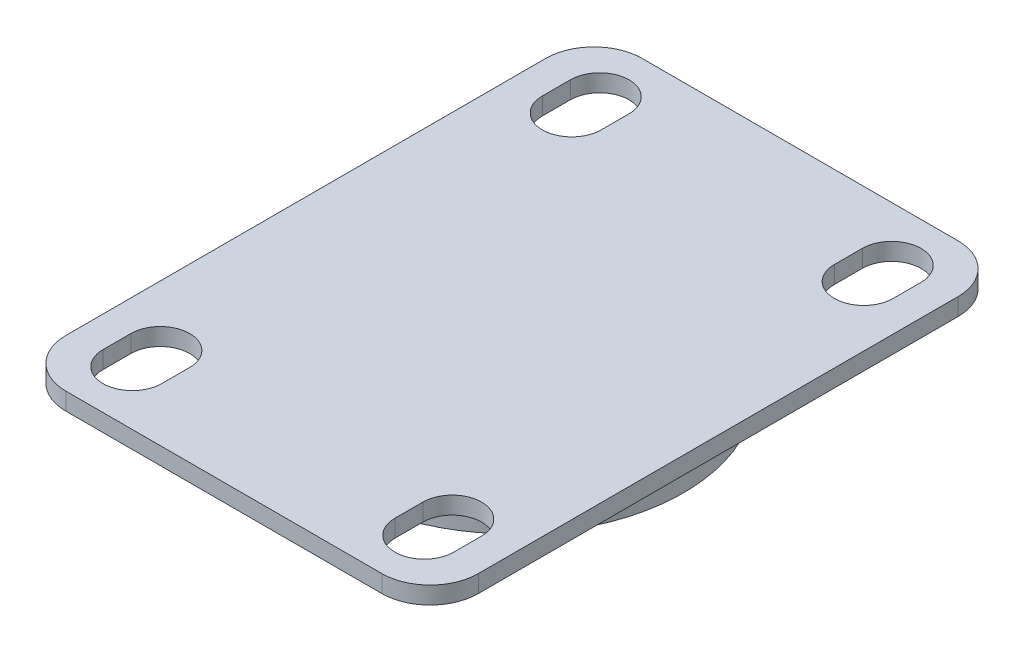
ISO-10303-21;
HEADER;
FILE_DESCRIPTION(('STEP AP214'),'2;1');
FILE_NAME('part.step','',(''),(''),'','','');
FILE_SCHEMA(('AUTOMOTIVE_DESIGN { 1 0 10303 214 1 1 1 1 }'));
ENDSEC;
DATA;
#1=APPLICATION_CONTEXT('core data for automotive mechanical design processes');
#2=APPLICATION_PROTOCOL_DEFINITION('international standard','automotive_design',2000,#1);
#3=PRODUCT_CONTEXT('',#1,'mechanical');
#4=PRODUCT('Part','Part','',(#3));
#5=PRODUCT_RELATED_PRODUCT_CATEGORY('part','',(#4));
#6=PRODUCT_DEFINITION_FORMATION('','',#4);
#7=PRODUCT_DEFINITION_CONTEXT('part definition',#1,'design');
#8=PRODUCT_DEFINITION('design','',#6,#7);
#9=PRODUCT_DEFINITION_SHAPE('','',#8);
#10=(LENGTH_UNIT() NAMED_UNIT(*) SI_UNIT(.MILLI.,.METRE.));
#11=(NAMED_UNIT(*) PLANE_ANGLE_UNIT() SI_UNIT($,.RADIAN.));
#12=(NAMED_UNIT(*) SI_UNIT($,.STERADIAN.) SOLID_ANGLE_UNIT());
#13=UNCERTAINTY_MEASURE_WITH_UNIT(LENGTH_MEASURE(1.E-05),#10,'distance_accuracy_value','');
#14=(GEOMETRIC_REPRESENTATION_CONTEXT(3) GLOBAL_UNCERTAINTY_ASSIGNED_CONTEXT((#13)) GLOBAL_UNIT_ASSIGNED_CONTEXT((#10,
#11,#12)) REPRESENTATION_CONTEXT('',''));
#15=CARTESIAN_POINT('',(0.,0.,0.));
#16=DIRECTION('',(0.,0.,1.));
#17=DIRECTION('',(1.,0.,0.));
#18=AXIS2_PLACEMENT_3D('',#15,#16,#17);
#19=CARTESIAN_POINT('',(0.,-5.2,0.));
#20=DIRECTION('',(0.,1.,0.));
#21=DIRECTION('',(0.,0.,1.));
#22=AXIS2_PLACEMENT_3D('',#19,#20,#21);
#23=CYLINDRICAL_SURFACE('',#22,17.8);
#24=CARTESIAN_POINT('',(0.,-5.2,0.));
#25=DIRECTION('',(0.,-1.,0.));
#26=DIRECTION('',(0.,0.,-1.));
#27=AXIS2_PLACEMENT_3D('',#24,#25,#26);
#28=CIRCLE('',#27,17.8);
#29=CARTESIAN_POINT('',(0.,-5.2,-17.8));
#30=VERTEX_POINT('',#29);
#31=EDGE_CURVE('E12',#30,#30,#28,.T.);
#32=ORIENTED_EDGE('',*,*,#31,.F.);
#33=EDGE_LOOP('',(#32));
#34=FACE_BOUND('',#33,.T.);
#35=CARTESIAN_POINT('',(0.,-3.2,0.));
#36=DIRECTION('',(0.,-1.,0.));
#37=DIRECTION('',(0.,0.,-1.));
#38=AXIS2_PLACEMENT_3D('',#35,#36,#37);
#39=CIRCLE('',#38,17.8);
#40=CARTESIAN_POINT('',(0.,-3.2,-17.8));
#41=VERTEX_POINT('',#40);
#42=EDGE_CURVE('E49',#41,#41,#39,.T.);
#43=ORIENTED_EDGE('',*,*,#42,.T.);
#44=EDGE_LOOP('',(#43));
#45=FACE_BOUND('',#44,.T.);
#46=ADVANCED_FACE('F46',(#34,#45),#23,.T.);
#47=CARTESIAN_POINT('',(0.,-5.2,0.));
#48=DIRECTION('',(0.,-1.,0.));
#49=DIRECTION('',(0.,0.,-1.));
#50=AXIS2_PLACEMENT_3D('',#47,#48,#49);
#51=PLANE('',#50);
#52=ORIENTED_EDGE('',*,*,#31,.T.);
#53=EDGE_LOOP('',(#52));
#54=FACE_BOUND('',#53,.T.);
#55=ADVANCED_FACE('F61',(#54),#51,.T.);
#56=CARTESIAN_POINT('',(0.,-3.2,0.));
#57=DIRECTION('',(0.,-1.,0.));
#58=DIRECTION('',(0.,0.,-1.));
#59=AXIS2_PLACEMENT_3D('',#56,#57,#58);
#60=PLANE('',#59);
#61=ORIENTED_EDGE('',*,*,#42,.F.);
#62=EDGE_LOOP('',(#61));
#63=FACE_BOUND('',#62,.T.);
#64=ADVANCED_FACE('F59',(#63),#60,.F.);
#65=CLOSED_SHELL('',(#46,#55,#64));
#66=MANIFOLD_SOLID_BREP('B2',#65);
#67=CARTESIAN_POINT('',(-16.4,0.,24.9));
#68=DIRECTION('',(0.,-1.,0.));
#69=DIRECTION('',(0.,0.,-1.));
#70=AXIS2_PLACEMENT_3D('',#67,#68,#69);
#71=PLANE('',#70);
#72=DIRECTION('',(0.,0.,1.));
#73=VECTOR('',#72,1.);
#74=CARTESIAN_POINT('',(12.1,0.,24.25));
#75=LINE('',#74,#73);
#76=CARTESIAN_POINT('',(12.1,0.,21.35));
#77=VERTEX_POINT('',#76);
#78=CARTESIAN_POINT('',(12.1,0.,24.25));
#79=VERTEX_POINT('',#78);
#80=EDGE_CURVE('E256',#77,#79,#75,.T.);
#81=ORIENTED_EDGE('',*,*,#80,.T.);
#82=CARTESIAN_POINT('',(15.15,0.,24.25));
#83=DIRECTION('',(0.,1.,0.));
#84=DIRECTION('',(0.,0.,1.));
#85=AXIS2_PLACEMENT_3D('',#82,#83,#84);
#86=CIRCLE('',#85,3.05);
#87=CARTESIAN_POINT('',(18.2,0.,24.25));
#88=VERTEX_POINT('',#87);
#89=EDGE_CURVE('E109',#79,#88,#86,.T.);
#90=ORIENTED_EDGE('',*,*,#89,.T.);
#91=DIRECTION('',(0.,0.,-1.));
#92=VECTOR('',#91,1.);
#93=CARTESIAN_POINT('',(18.2,0.,24.25));
#94=LINE('',#93,#92);
#95=CARTESIAN_POINT('',(18.2,0.,21.35));
#96=VERTEX_POINT('',#95);
#97=EDGE_CURVE('E262',#88,#96,#94,.T.);
#98=ORIENTED_EDGE('',*,*,#97,.T.);
#99=CARTESIAN_POINT('',(15.15,0.,21.35));
#100=DIRECTION('',(0.,1.,0.));
#101=DIRECTION('',(0.,0.,1.));
#102=AXIS2_PLACEMENT_3D('',#99,#100,#101);
#103=CIRCLE('',#102,3.05);
#104=EDGE_CURVE('E278',#96,#77,#103,.T.);
#105=ORIENTED_EDGE('',*,*,#104,.T.);
#106=EDGE_LOOP('',(#81,#90,#98,#105));
#107=FACE_BOUND('',#106,.T.);
#108=DIRECTION('',(0.,0.,-1.));
#109=VECTOR('',#108,1.);
#110=CARTESIAN_POINT('',(18.2,0.,-24.25));
#111=LINE('',#110,#109);
#112=CARTESIAN_POINT('',(18.2,0.,-21.35));
#113=VERTEX_POINT('',#112);
#114=CARTESIAN_POINT('',(18.2,0.,-24.25));
#115=VERTEX_POINT('',#114);
#116=EDGE_CURVE('E289',#113,#115,#111,.T.);
#117=ORIENTED_EDGE('',*,*,#116,.T.);
#118=CARTESIAN_POINT('',(15.15,0.,-24.25));
#119=DIRECTION('',(0.,1.,0.));
#120=DIRECTION('',(0.,0.,-1.));
#121=AXIS2_PLACEMENT_3D('',#118,#119,#120);
#122=CIRCLE('',#121,3.05);
#123=CARTESIAN_POINT('',(12.1,0.,-24.25));
#124=VERTEX_POINT('',#123);
#125=EDGE_CURVE('E263',#115,#124,#122,.T.);
#126=ORIENTED_EDGE('',*,*,#125,.T.);
#127=DIRECTION('',(0.,0.,1.));
#128=VECTOR('',#127,1.);
#129=CARTESIAN_POINT('',(12.1,0.,-24.25));
#130=LINE('',#129,#128);
#131=CARTESIAN_POINT('',(12.1,0.,-21.35));
#132=VERTEX_POINT('',#131);
#133=EDGE_CURVE('E299',#124,#132,#130,.T.);
#134=ORIENTED_EDGE('',*,*,#133,.T.);
#135=CARTESIAN_POINT('',(15.15,0.,-21.35));
#136=DIRECTION('',(0.,1.,0.));
#137=DIRECTION('',(0.,0.,-1.));
#138=AXIS2_PLACEMENT_3D('',#135,#136,#137);
#139=CIRCLE('',#138,3.05);
#140=EDGE_CURVE('E302',#132,#113,#139,.T.);
#141=ORIENTED_EDGE('',*,*,#140,.T.);
#142=EDGE_LOOP('',(#117,#126,#134,#141));
#143=FACE_BOUND('',#142,.T.);
#144=DIRECTION('',(0.,0.,1.));
#145=VECTOR('',#144,1.);
#146=CARTESIAN_POINT('',(-18.2,0.,24.25));
#147=LINE('',#146,#145);
#148=CARTESIAN_POINT('',(-18.2,0.,21.35));
#149=VERTEX_POINT('',#148);
#150=CARTESIAN_POINT('',(-18.2,0.,24.25));
#151=VERTEX_POINT('',#150);
#152=EDGE_CURVE('E320',#149,#151,#147,.T.);
#153=ORIENTED_EDGE('',*,*,#152,.T.);
#154=CARTESIAN_POINT('',(-15.15,0.,24.25));
#155=DIRECTION('',(0.,1.,0.));
#156=DIRECTION('',(0.,0.,-1.));
#157=AXIS2_PLACEMENT_3D('',#154,#155,#156);
#158=CIRCLE('',#157,3.05);
#159=CARTESIAN_POINT('',(-12.1,0.,24.25));
#160=VERTEX_POINT('',#159);
#161=EDGE_CURVE('E316',#151,#160,#158,.T.);
#162=ORIENTED_EDGE('',*,*,#161,.T.);
#163=DIRECTION('',(0.,0.,-1.));
#164=VECTOR('',#163,1.);
#165=CARTESIAN_POINT('',(-12.1,0.,24.25));
#166=LINE('',#165,#164);
#167=CARTESIAN_POINT('',(-12.1,0.,21.35));
#168=VERTEX_POINT('',#167);
#169=EDGE_CURVE('E330',#160,#168,#166,.T.);
#170=ORIENTED_EDGE('',*,*,#169,.T.);
#171=CARTESIAN_POINT('',(-15.15,0.,21.35));
#172=DIRECTION('',(0.,1.,0.));
#173=DIRECTION('',(0.,0.,-1.));
#174=AXIS2_PLACEMENT_3D('',#171,#172,#173);
#175=CIRCLE('',#174,3.05);
#176=EDGE_CURVE('E333',#168,#149,#175,.T.);
#177=ORIENTED_EDGE('',*,*,#176,.T.);
#178=EDGE_LOOP('',(#153,#162,#170,#177));
#179=FACE_BOUND('',#178,.T.);
#180=DIRECTION('',(0.,0.,-1.));
#181=VECTOR('',#180,1.);
#182=CARTESIAN_POINT('',(-12.1,0.,-24.25));
#183=LINE('',#182,#181);
#184=CARTESIAN_POINT('',(-12.1,0.,-21.35));
#185=VERTEX_POINT('',#184);
#186=CARTESIAN_POINT('',(-12.1,0.,-24.25));
#187=VERTEX_POINT('',#186);
#188=EDGE_CURVE('E351',#185,#187,#183,.T.);
#189=ORIENTED_EDGE('',*,*,#188,.T.);
#190=CARTESIAN_POINT('',(-15.15,0.,-24.25));
#191=DIRECTION('',(0.,1.,0.));
#192=DIRECTION('',(0.,0.,1.));
#193=AXIS2_PLACEMENT_3D('',#190,#191,#192);
#194=CIRCLE('',#193,3.05);
#195=CARTESIAN_POINT('',(-18.2,0.,-24.25));
#196=VERTEX_POINT('',#195);
#197=EDGE_CURVE('E347',#187,#196,#194,.T.);
#198=ORIENTED_EDGE('',*,*,#197,.T.);
#199=DIRECTION('',(0.,0.,1.));
#200=VECTOR('',#199,1.);
#201=CARTESIAN_POINT('',(-18.2,0.,-24.25));
#202=LINE('',#201,#200);
#203=CARTESIAN_POINT('',(-18.2,0.,-21.35));
#204=VERTEX_POINT('',#203);
#205=EDGE_CURVE('E361',#196,#204,#202,.T.);
#206=ORIENTED_EDGE('',*,*,#205,.T.);
#207=CARTESIAN_POINT('',(-15.15,0.,-21.35));
#208=DIRECTION('',(0.,1.,0.));
#209=DIRECTION('',(0.,0.,1.));
#210=AXIS2_PLACEMENT_3D('',#207,#208,#209);
#211=CIRCLE('',#210,3.05);
#212=EDGE_CURVE('E364',#204,#185,#211,.T.);
#213=ORIENTED_EDGE('',*,*,#212,.T.);
#214=EDGE_LOOP('',(#189,#198,#206,#213));
#215=FACE_BOUND('',#214,.T.);
#216=CARTESIAN_POINT('',(-16.4,0.,24.9));
#217=DIRECTION('',(0.,1.,0.));
#218=DIRECTION('',(0.,0.,-1.));
#219=AXIS2_PLACEMENT_3D('',#216,#217,#218);
#220=CIRCLE('',#219,5.);
#221=CARTESIAN_POINT('',(-21.4,0.,24.9));
#222=VERTEX_POINT('',#221);
#223=CARTESIAN_POINT('',(-16.4,0.,29.9));
#224=VERTEX_POINT('',#223);
#225=EDGE_CURVE('E378',#222,#224,#220,.T.);
#226=ORIENTED_EDGE('',*,*,#225,.F.);
#227=DIRECTION('',(0.,0.,1.));
#228=VECTOR('',#227,1.);
#229=CARTESIAN_POINT('',(-21.4,0.,24.9));
#230=LINE('',#229,#228);
#231=CARTESIAN_POINT('',(-21.4,0.,-24.9));
#232=VERTEX_POINT('',#231);
#233=EDGE_CURVE('E383',#232,#222,#230,.T.);
#234=ORIENTED_EDGE('',*,*,#233,.F.);
#235=CARTESIAN_POINT('',(-16.4,0.,-24.9));
#236=DIRECTION('',(0.,1.,0.));
#237=DIRECTION('',(0.,0.,-1.));
#238=AXIS2_PLACEMENT_3D('',#235,#236,#237);
#239=CIRCLE('',#238,5.);
#240=CARTESIAN_POINT('',(-16.4,0.,-29.9));
#241=VERTEX_POINT('',#240);
#242=EDGE_CURVE('E410',#241,#232,#239,.T.);
#243=ORIENTED_EDGE('',*,*,#242,.F.);
#244=DIRECTION('',(-1.,0.,0.));
#245=VECTOR('',#244,1.);
#246=CARTESIAN_POINT('',(-16.4,0.,-29.9));
#247=LINE('',#246,#245);
#248=CARTESIAN_POINT('',(16.4,0.,-29.9));
#249=VERTEX_POINT('',#248);
#250=EDGE_CURVE('E408',#249,#241,#247,.T.);
#251=ORIENTED_EDGE('',*,*,#250,.F.);
#252=CARTESIAN_POINT('',(16.4,0.,-24.9));
#253=DIRECTION('',(0.,1.,0.));
#254=DIRECTION('',(0.,0.,1.));
#255=AXIS2_PLACEMENT_3D('',#252,#253,#254);
#256=CIRCLE('',#255,5.);
#257=CARTESIAN_POINT('',(21.4,0.,-24.9));
#258=VERTEX_POINT('',#257);
#259=EDGE_CURVE('E406',#258,#249,#256,.T.);
#260=ORIENTED_EDGE('',*,*,#259,.F.);
#261=DIRECTION('',(0.,0.,-1.));
#262=VECTOR('',#261,1.);
#263=CARTESIAN_POINT('',(21.4,0.,24.9));
#264=LINE('',#263,#262);
#265=CARTESIAN_POINT('',(21.4,0.,24.9));
#266=VERTEX_POINT('',#265);
#267=EDGE_CURVE('E404',#266,#258,#264,.T.);
#268=ORIENTED_EDGE('',*,*,#267,.F.);
#269=CARTESIAN_POINT('',(16.4,0.,24.9));
#270=DIRECTION('',(0.,1.,0.));
#271=DIRECTION('',(0.,0.,-1.));
#272=AXIS2_PLACEMENT_3D('',#269,#270,#271);
#273=CIRCLE('',#272,5.);
#274=CARTESIAN_POINT('',(16.4,0.,29.9));
#275=VERTEX_POINT('',#274);
#276=EDGE_CURVE('E402',#275,#266,#273,.T.);
#277=ORIENTED_EDGE('',*,*,#276,.F.);
#278=DIRECTION('',(1.,0.,0.));
#279=VECTOR('',#278,1.);
#280=CARTESIAN_POINT('',(-16.4,0.,29.9));
#281=LINE('',#280,#279);
#282=EDGE_CURVE('E400',#224,#275,#281,.T.);
#283=ORIENTED_EDGE('',*,*,#282,.F.);
#284=EDGE_LOOP('',(#226,#234,#243,#251,#260,#268,#277,#283));
#285=FACE_BOUND('',#284,.T.);
#286=CARTESIAN_POINT('',(0.,0.,0.));
#287=DIRECTION('',(0.,-1.,0.));
#288=DIRECTION('',(0.,0.,-1.));
#289=AXIS2_PLACEMENT_3D('',#286,#287,#288);
#290=CIRCLE('',#289,15.95);
#291=CARTESIAN_POINT('',(0.,0.,-15.95));
#292=VERTEX_POINT('',#291);
#293=EDGE_CURVE('E276',#292,#292,#290,.T.);
#294=ORIENTED_EDGE('',*,*,#293,.F.);
#295=EDGE_LOOP('',(#294));
#296=FACE_BOUND('',#295,.T.);
#297=ADVANCED_FACE('F86',(#107,#143,#179,#215,#285,#296),#71,.T.);
#298=CARTESIAN_POINT('',(-16.4,1.8,24.9));
#299=DIRECTION('',(0.,-1.,0.));
#300=DIRECTION('',(0.,0.,-1.));
#301=AXIS2_PLACEMENT_3D('',#298,#299,#300);
#302=PLANE('',#301);
#303=CARTESIAN_POINT('',(15.15,1.8,-24.25));
#304=DIRECTION('',(0.,1.,0.));
#305=DIRECTION('',(0.,0.,-1.));
#306=AXIS2_PLACEMENT_3D('',#303,#304,#305);
#307=CIRCLE('',#306,3.05);
#308=CARTESIAN_POINT('',(18.2,1.8,-24.25));
#309=VERTEX_POINT('',#308);
#310=CARTESIAN_POINT('',(12.1,1.8,-24.25));
#311=VERTEX_POINT('',#310);
#312=EDGE_CURVE('E286',#309,#311,#307,.T.);
#313=ORIENTED_EDGE('',*,*,#312,.F.);
#314=DIRECTION('',(0.,0.,-1.));
#315=VECTOR('',#314,1.);
#316=CARTESIAN_POINT('',(18.2,1.8,-24.25));
#317=LINE('',#316,#315);
#318=CARTESIAN_POINT('',(18.2,1.8,-21.35));
#319=VERTEX_POINT('',#318);
#320=EDGE_CURVE('E294',#319,#309,#317,.T.);
#321=ORIENTED_EDGE('',*,*,#320,.F.);
#322=CARTESIAN_POINT('',(15.15,1.8,-21.35));
#323=DIRECTION('',(0.,1.,0.));
#324=DIRECTION('',(0.,0.,-1.));
#325=AXIS2_PLACEMENT_3D('',#322,#323,#324);
#326=CIRCLE('',#325,3.05);
#327=CARTESIAN_POINT('',(12.1,1.8,-21.35));
#328=VERTEX_POINT('',#327);
#329=EDGE_CURVE('E291',#328,#319,#326,.T.);
#330=ORIENTED_EDGE('',*,*,#329,.F.);
#331=DIRECTION('',(0.,0.,1.));
#332=VECTOR('',#331,1.);
#333=CARTESIAN_POINT('',(12.1,1.8,-24.25));
#334=LINE('',#333,#332);
#335=EDGE_CURVE('E288',#311,#328,#334,.T.);
#336=ORIENTED_EDGE('',*,*,#335,.F.);
#337=EDGE_LOOP('',(#313,#321,#330,#336));
#338=FACE_BOUND('',#337,.T.);
#339=CARTESIAN_POINT('',(-15.15,1.8,-24.25));
#340=DIRECTION('',(0.,1.,0.));
#341=DIRECTION('',(0.,0.,1.));
#342=AXIS2_PLACEMENT_3D('',#339,#340,#341);
#343=CIRCLE('',#342,3.05);
#344=CARTESIAN_POINT('',(-12.1,1.8,-24.25));
#345=VERTEX_POINT('',#344);
#346=CARTESIAN_POINT('',(-18.2,1.8,-24.25));
#347=VERTEX_POINT('',#346);
#348=EDGE_CURVE('E348',#345,#347,#343,.T.);
#349=ORIENTED_EDGE('',*,*,#348,.F.);
#350=DIRECTION('',(0.,0.,-1.));
#351=VECTOR('',#350,1.);
#352=CARTESIAN_POINT('',(-12.1,1.8,-24.25));
#353=LINE('',#352,#351);
#354=CARTESIAN_POINT('',(-12.1,1.8,-21.35));
#355=VERTEX_POINT('',#354);
#356=EDGE_CURVE('E356',#355,#345,#353,.T.);
#357=ORIENTED_EDGE('',*,*,#356,.F.);
#358=CARTESIAN_POINT('',(-15.15,1.8,-21.35));
#359=DIRECTION('',(0.,1.,0.));
#360=DIRECTION('',(0.,0.,1.));
#361=AXIS2_PLACEMENT_3D('',#358,#359,#360);
#362=CIRCLE('',#361,3.05);
#363=CARTESIAN_POINT('',(-18.2,1.8,-21.35));
#364=VERTEX_POINT('',#363);
#365=EDGE_CURVE('E353',#364,#355,#362,.T.);
#366=ORIENTED_EDGE('',*,*,#365,.F.);
#367=DIRECTION('',(0.,0.,1.));
#368=VECTOR('',#367,1.);
#369=CARTESIAN_POINT('',(-18.2,1.8,-24.25));
#370=LINE('',#369,#368);
#371=EDGE_CURVE('E350',#347,#364,#370,.T.);
#372=ORIENTED_EDGE('',*,*,#371,.F.);
#373=EDGE_LOOP('',(#349,#357,#366,#372));
#374=FACE_BOUND('',#373,.T.);
#375=CARTESIAN_POINT('',(-16.4,1.8,24.9));
#376=DIRECTION('',(0.,1.,0.));
#377=DIRECTION('',(0.,0.,-1.));
#378=AXIS2_PLACEMENT_3D('',#375,#376,#377);
#379=CIRCLE('',#378,5.);
#380=CARTESIAN_POINT('',(-21.4,1.8,24.9));
#381=VERTEX_POINT('',#380);
#382=CARTESIAN_POINT('',(-16.4,1.8,29.9));
#383=VERTEX_POINT('',#382);
#384=EDGE_CURVE('E379',#381,#383,#379,.T.);
#385=ORIENTED_EDGE('',*,*,#384,.T.);
#386=DIRECTION('',(1.,0.,0.));
#387=VECTOR('',#386,1.);
#388=CARTESIAN_POINT('',(-16.4,1.8,29.9));
#389=LINE('',#388,#387);
#390=CARTESIAN_POINT('',(16.4,1.8,29.9));
#391=VERTEX_POINT('',#390);
#392=EDGE_CURVE('E382',#383,#391,#389,.T.);
#393=ORIENTED_EDGE('',*,*,#392,.T.);
#394=CARTESIAN_POINT('',(16.4,1.8,24.9));
#395=DIRECTION('',(0.,1.,0.));
#396=DIRECTION('',(0.,0.,-1.));
#397=AXIS2_PLACEMENT_3D('',#394,#395,#396);
#398=CIRCLE('',#397,5.);
#399=CARTESIAN_POINT('',(21.4,1.8,24.9));
#400=VERTEX_POINT('',#399);
#401=EDGE_CURVE('E385',#391,#400,#398,.T.);
#402=ORIENTED_EDGE('',*,*,#401,.T.);
#403=DIRECTION('',(0.,0.,-1.));
#404=VECTOR('',#403,1.);
#405=CARTESIAN_POINT('',(21.4,1.8,24.9));
#406=LINE('',#405,#404);
#407=CARTESIAN_POINT('',(21.4,1.8,-24.9));
#408=VERTEX_POINT('',#407);
#409=EDGE_CURVE('E387',#400,#408,#406,.T.);
#410=ORIENTED_EDGE('',*,*,#409,.T.);
#411=CARTESIAN_POINT('',(16.4,1.8,-24.9));
#412=DIRECTION('',(0.,1.,0.));
#413=DIRECTION('',(0.,0.,1.));
#414=AXIS2_PLACEMENT_3D('',#411,#412,#413);
#415=CIRCLE('',#414,5.);
#416=CARTESIAN_POINT('',(16.4,1.8,-29.9));
#417=VERTEX_POINT('',#416);
#418=EDGE_CURVE('E389',#408,#417,#415,.T.);
#419=ORIENTED_EDGE('',*,*,#418,.T.);
#420=DIRECTION('',(-1.,0.,0.));
#421=VECTOR('',#420,1.);
#422=CARTESIAN_POINT('',(-16.4,1.8,-29.9));
#423=LINE('',#422,#421);
#424=CARTESIAN_POINT('',(-16.4,1.8,-29.9));
#425=VERTEX_POINT('',#424);
#426=EDGE_CURVE('E391',#417,#425,#423,.T.);
#427=ORIENTED_EDGE('',*,*,#426,.T.);
#428=CARTESIAN_POINT('',(-16.4,1.8,-24.9));
#429=DIRECTION('',(0.,1.,0.));
#430=DIRECTION('',(0.,0.,-1.));
#431=AXIS2_PLACEMENT_3D('',#428,#429,#430);
#432=CIRCLE('',#431,5.);
#433=CARTESIAN_POINT('',(-21.4,1.8,-24.9));
#434=VERTEX_POINT('',#433);
#435=EDGE_CURVE('E393',#425,#434,#432,.T.);
#436=ORIENTED_EDGE('',*,*,#435,.T.);
#437=DIRECTION('',(0.,0.,1.));
#438=VECTOR('',#437,1.);
#439=CARTESIAN_POINT('',(-21.4,1.8,24.9));
#440=LINE('',#439,#438);
#441=EDGE_CURVE('E395',#434,#381,#440,.T.);
#442=ORIENTED_EDGE('',*,*,#441,.T.);
#443=EDGE_LOOP('',(#385,#393,#402,#410,#419,#427,#436,#442));
#444=FACE_BOUND('',#443,.T.);
#445=CARTESIAN_POINT('',(-15.15,1.8,24.25));
#446=DIRECTION('',(0.,1.,0.));
#447=DIRECTION('',(0.,0.,-1.));
#448=AXIS2_PLACEMENT_3D('',#445,#446,#447);
#449=CIRCLE('',#448,3.05);
#450=CARTESIAN_POINT('',(-18.2,1.8,24.25));
#451=VERTEX_POINT('',#450);
#452=CARTESIAN_POINT('',(-12.1,1.8,24.25));
#453=VERTEX_POINT('',#452);
#454=EDGE_CURVE('E317',#451,#453,#449,.T.);
#455=ORIENTED_EDGE('',*,*,#454,.F.);
#456=DIRECTION('',(0.,0.,1.));
#457=VECTOR('',#456,1.);
#458=CARTESIAN_POINT('',(-18.2,1.8,24.25));
#459=LINE('',#458,#457);
#460=CARTESIAN_POINT('',(-18.2,1.8,21.35));
#461=VERTEX_POINT('',#460);
#462=EDGE_CURVE('E325',#461,#451,#459,.T.);
#463=ORIENTED_EDGE('',*,*,#462,.F.);
#464=CARTESIAN_POINT('',(-15.15,1.8,21.35));
#465=DIRECTION('',(0.,1.,0.));
#466=DIRECTION('',(0.,0.,-1.));
#467=AXIS2_PLACEMENT_3D('',#464,#465,#466);
#468=CIRCLE('',#467,3.05);
#469=CARTESIAN_POINT('',(-12.1,1.8,21.35));
#470=VERTEX_POINT('',#469);
#471=EDGE_CURVE('E322',#470,#461,#468,.T.);
#472=ORIENTED_EDGE('',*,*,#471,.F.);
#473=DIRECTION('',(0.,0.,-1.));
#474=VECTOR('',#473,1.);
#475=CARTESIAN_POINT('',(-12.1,1.8,24.25));
#476=LINE('',#475,#474);
#477=EDGE_CURVE('E319',#453,#470,#476,.T.);
#478=ORIENTED_EDGE('',*,*,#477,.F.);
#479=EDGE_LOOP('',(#455,#463,#472,#478));
#480=FACE_BOUND('',#479,.T.);
#481=CARTESIAN_POINT('',(15.15,1.8,24.25));
#482=DIRECTION('',(0.,1.,0.));
#483=DIRECTION('',(0.,0.,1.));
#484=AXIS2_PLACEMENT_3D('',#481,#482,#483);
#485=CIRCLE('',#484,3.05);
#486=CARTESIAN_POINT('',(12.1,1.8,24.25));
#487=VERTEX_POINT('',#486);
#488=CARTESIAN_POINT('',(18.2,1.8,24.25));
#489=VERTEX_POINT('',#488);
#490=EDGE_CURVE('E247',#487,#489,#485,.T.);
#491=ORIENTED_EDGE('',*,*,#490,.F.);
#492=DIRECTION('',(0.,0.,1.));
#493=VECTOR('',#492,1.);
#494=CARTESIAN_POINT('',(12.1,1.8,24.25));
#495=LINE('',#494,#493);
#496=CARTESIAN_POINT('',(12.1,1.8,21.35));
#497=VERTEX_POINT('',#496);
#498=EDGE_CURVE('E270',#497,#487,#495,.T.);
#499=ORIENTED_EDGE('',*,*,#498,.F.);
#500=CARTESIAN_POINT('',(15.15,1.8,21.35));
#501=DIRECTION('',(0.,1.,0.));
#502=DIRECTION('',(0.,0.,1.));
#503=AXIS2_PLACEMENT_3D('',#500,#501,#502);
#504=CIRCLE('',#503,3.05);
#505=CARTESIAN_POINT('',(18.2,1.8,21.35));
#506=VERTEX_POINT('',#505);
#507=EDGE_CURVE('E268',#506,#497,#504,.T.);
#508=ORIENTED_EDGE('',*,*,#507,.F.);
#509=DIRECTION('',(0.,0.,-1.));
#510=VECTOR('',#509,1.);
#511=CARTESIAN_POINT('',(18.2,1.8,24.25));
#512=LINE('',#511,#510);
#513=EDGE_CURVE('E255',#489,#506,#512,.T.);
#514=ORIENTED_EDGE('',*,*,#513,.F.);
#515=EDGE_LOOP('',(#491,#499,#508,#514));
#516=FACE_BOUND('',#515,.T.);
#517=ADVANCED_FACE('F267',(#338,#374,#444,#480,#516),#302,.F.);
#518=CARTESIAN_POINT('',(-16.4,1.8,24.9));
#519=DIRECTION('',(0.,-1.,0.));
#520=DIRECTION('',(0.,0.,-1.));
#521=AXIS2_PLACEMENT_3D('',#518,#519,#520);
#522=CYLINDRICAL_SURFACE('',#521,5.);
#523=ORIENTED_EDGE('',*,*,#225,.T.);
#524=DIRECTION('',(0.,-1.,0.));
#525=VECTOR('',#524,1.);
#526=CARTESIAN_POINT('',(-16.4,1.8,29.9));
#527=LINE('',#526,#525);
#528=EDGE_CURVE('E44',#383,#224,#527,.T.);
#529=ORIENTED_EDGE('',*,*,#528,.F.);
#530=ORIENTED_EDGE('',*,*,#384,.F.);
#531=DIRECTION('',(0.,-1.,0.));
#532=VECTOR('',#531,1.);
#533=CARTESIAN_POINT('',(-21.4,1.8,24.9));
#534=LINE('',#533,#532);
#535=EDGE_CURVE('E397',#381,#222,#534,.T.);
#536=ORIENTED_EDGE('',*,*,#535,.T.);
#537=EDGE_LOOP('',(#523,#529,#530,#536));
#538=FACE_BOUND('',#537,.T.);
#539=ADVANCED_FACE('F88',(#538),#522,.T.);
#540=CARTESIAN_POINT('',(-16.4,1.8,29.9));
#541=DIRECTION('',(0.,0.,-1.));
#542=DIRECTION('',(-1.,0.,0.));
#543=AXIS2_PLACEMENT_3D('',#540,#541,#542);
#544=PLANE('',#543);
#545=ORIENTED_EDGE('',*,*,#282,.T.);
#546=DIRECTION('',(0.,-1.,0.));
#547=VECTOR('',#546,1.);
#548=CARTESIAN_POINT('',(16.4,1.8,29.9));
#549=LINE('',#548,#547);
#550=EDGE_CURVE('E94',#391,#275,#549,.T.);
#551=ORIENTED_EDGE('',*,*,#550,.F.);
#552=ORIENTED_EDGE('',*,*,#392,.F.);
#553=ORIENTED_EDGE('',*,*,#528,.T.);
#554=EDGE_LOOP('',(#545,#551,#552,#553));
#555=FACE_BOUND('',#554,.T.);
#556=ADVANCED_FACE('F457',(#555),#544,.F.);
#557=CARTESIAN_POINT('',(16.4,1.8,24.9));
#558=DIRECTION('',(0.,-1.,0.));
#559=DIRECTION('',(0.,0.,-1.));
#560=AXIS2_PLACEMENT_3D('',#557,#558,#559);
#561=CYLINDRICAL_SURFACE('',#560,5.);
#562=ORIENTED_EDGE('',*,*,#276,.T.);
#563=DIRECTION('',(0.,-1.,0.));
#564=VECTOR('',#563,1.);
#565=CARTESIAN_POINT('',(21.4,1.8,24.9));
#566=LINE('',#565,#564);
#567=EDGE_CURVE('E427',#400,#266,#566,.T.);
#568=ORIENTED_EDGE('',*,*,#567,.F.);
#569=ORIENTED_EDGE('',*,*,#401,.F.);
#570=ORIENTED_EDGE('',*,*,#550,.T.);
#571=EDGE_LOOP('',(#562,#568,#569,#570));
#572=FACE_BOUND('',#571,.T.);
#573=ADVANCED_FACE('F434',(#572),#561,.T.);
#574=CARTESIAN_POINT('',(21.4,1.8,24.9));
#575=DIRECTION('',(-1.,0.,0.));
#576=DIRECTION('',(0.,0.,1.));
#577=AXIS2_PLACEMENT_3D('',#574,#575,#576);
#578=PLANE('',#577);
#579=ORIENTED_EDGE('',*,*,#267,.T.);
#580=DIRECTION('',(0.,-1.,0.));
#581=VECTOR('',#580,1.);
#582=CARTESIAN_POINT('',(21.4,1.8,-24.9));
#583=LINE('',#582,#581);
#584=EDGE_CURVE('E424',#408,#258,#583,.T.);
#585=ORIENTED_EDGE('',*,*,#584,.F.);
#586=ORIENTED_EDGE('',*,*,#409,.F.);
#587=ORIENTED_EDGE('',*,*,#567,.T.);
#588=EDGE_LOOP('',(#579,#585,#586,#587));
#589=FACE_BOUND('',#588,.T.);
#590=ADVANCED_FACE('F445',(#589),#578,.F.);
#591=CARTESIAN_POINT('',(16.4,1.8,-24.9));
#592=DIRECTION('',(0.,-1.,0.));
#593=DIRECTION('',(0.,0.,-1.));
#594=AXIS2_PLACEMENT_3D('',#591,#592,#593);
#595=CYLINDRICAL_SURFACE('',#594,5.);
#596=ORIENTED_EDGE('',*,*,#259,.T.);
#597=DIRECTION('',(0.,-1.,0.));
#598=VECTOR('',#597,1.);
#599=CARTESIAN_POINT('',(16.4,1.8,-29.9));
#600=LINE('',#599,#598);
#601=EDGE_CURVE('E421',#417,#249,#600,.T.);
#602=ORIENTED_EDGE('',*,*,#601,.F.);
#603=ORIENTED_EDGE('',*,*,#418,.F.);
#604=ORIENTED_EDGE('',*,*,#584,.T.);
#605=EDGE_LOOP('',(#596,#602,#603,#604));
#606=FACE_BOUND('',#605,.T.);
#607=ADVANCED_FACE('F449',(#606),#595,.T.);
#608=CARTESIAN_POINT('',(-16.4,1.8,-29.9));
#609=DIRECTION('',(0.,0.,1.));
#610=DIRECTION('',(1.,0.,0.));
#611=AXIS2_PLACEMENT_3D('',#608,#609,#610);
#612=PLANE('',#611);
#613=ORIENTED_EDGE('',*,*,#250,.T.);
#614=DIRECTION('',(0.,-1.,0.));
#615=VECTOR('',#614,1.);
#616=CARTESIAN_POINT('',(-16.4,1.8,-29.9));
#617=LINE('',#616,#615);
#618=EDGE_CURVE('E418',#425,#241,#617,.T.);
#619=ORIENTED_EDGE('',*,*,#618,.F.);
#620=ORIENTED_EDGE('',*,*,#426,.F.);
#621=ORIENTED_EDGE('',*,*,#601,.T.);
#622=EDGE_LOOP('',(#613,#619,#620,#621));
#623=FACE_BOUND('',#622,.T.);
#624=ADVANCED_FACE('F470',(#623),#612,.F.);
#625=CARTESIAN_POINT('',(-16.4,1.8,-24.9));
#626=DIRECTION('',(0.,-1.,0.));
#627=DIRECTION('',(0.,0.,-1.));
#628=AXIS2_PLACEMENT_3D('',#625,#626,#627);
#629=CYLINDRICAL_SURFACE('',#628,5.);
#630=ORIENTED_EDGE('',*,*,#242,.T.);
#631=DIRECTION('',(0.,-1.,0.));
#632=VECTOR('',#631,1.);
#633=CARTESIAN_POINT('',(-21.4,1.8,-24.9));
#634=LINE('',#633,#632);
#635=EDGE_CURVE('E415',#434,#232,#634,.T.);
#636=ORIENTED_EDGE('',*,*,#635,.F.);
#637=ORIENTED_EDGE('',*,*,#435,.F.);
#638=ORIENTED_EDGE('',*,*,#618,.T.);
#639=EDGE_LOOP('',(#630,#636,#637,#638));
#640=FACE_BOUND('',#639,.T.);
#641=ADVANCED_FACE('F468',(#640),#629,.T.);
#642=CARTESIAN_POINT('',(-21.4,1.8,24.9));
#643=DIRECTION('',(1.,0.,0.));
#644=DIRECTION('',(0.,0.,-1.));
#645=AXIS2_PLACEMENT_3D('',#642,#643,#644);
#646=PLANE('',#645);
#647=ORIENTED_EDGE('',*,*,#233,.T.);
#648=ORIENTED_EDGE('',*,*,#535,.F.);
#649=ORIENTED_EDGE('',*,*,#441,.F.);
#650=ORIENTED_EDGE('',*,*,#635,.T.);
#651=EDGE_LOOP('',(#647,#648,#649,#650));
#652=FACE_BOUND('',#651,.T.);
#653=ADVANCED_FACE('F463',(#652),#646,.F.);
#654=CARTESIAN_POINT('',(-15.15,1.8,-24.25));
#655=DIRECTION('',(0.,-1.,0.));
#656=DIRECTION('',(0.,0.,-1.));
#657=AXIS2_PLACEMENT_3D('',#654,#655,#656);
#658=CYLINDRICAL_SURFACE('',#657,3.05);
#659=ORIENTED_EDGE('',*,*,#197,.F.);
#660=DIRECTION('',(0.,-1.,0.));
#661=VECTOR('',#660,1.);
#662=CARTESIAN_POINT('',(-12.1,1.8,-24.25));
#663=LINE('',#662,#661);
#664=EDGE_CURVE('E358',#345,#187,#663,.T.);
#665=ORIENTED_EDGE('',*,*,#664,.F.);
#666=ORIENTED_EDGE('',*,*,#348,.T.);
#667=DIRECTION('',(0.,-1.,0.));
#668=VECTOR('',#667,1.);
#669=CARTESIAN_POINT('',(-18.2,1.8,-24.25));
#670=LINE('',#669,#668);
#671=EDGE_CURVE('E375',#347,#196,#670,.T.);
#672=ORIENTED_EDGE('',*,*,#671,.T.);
#673=EDGE_LOOP('',(#659,#665,#666,#672));
#674=FACE_BOUND('',#673,.T.);
#675=ADVANCED_FACE('F491',(#674),#658,.F.);
#676=CARTESIAN_POINT('',(-18.2,1.8,-24.25));
#677=DIRECTION('',(1.,0.,0.));
#678=DIRECTION('',(0.,0.,-1.));
#679=AXIS2_PLACEMENT_3D('',#676,#677,#678);
#680=PLANE('',#679);
#681=ORIENTED_EDGE('',*,*,#205,.F.);
#682=ORIENTED_EDGE('',*,*,#671,.F.);
#683=ORIENTED_EDGE('',*,*,#371,.T.);
#684=DIRECTION('',(0.,-1.,0.));
#685=VECTOR('',#684,1.);
#686=CARTESIAN_POINT('',(-18.2,1.8,-21.35));
#687=LINE('',#686,#685);
#688=EDGE_CURVE('E373',#364,#204,#687,.T.);
#689=ORIENTED_EDGE('',*,*,#688,.T.);
#690=EDGE_LOOP('',(#681,#682,#683,#689));
#691=FACE_BOUND('',#690,.T.);
#692=ADVANCED_FACE('F495',(#691),#680,.T.);
#693=CARTESIAN_POINT('',(-15.15,1.8,-21.35));
#694=DIRECTION('',(0.,-1.,0.));
#695=DIRECTION('',(0.,0.,-1.));
#696=AXIS2_PLACEMENT_3D('',#693,#694,#695);
#697=CYLINDRICAL_SURFACE('',#696,3.05);
#698=ORIENTED_EDGE('',*,*,#212,.F.);
#699=ORIENTED_EDGE('',*,*,#688,.F.);
#700=ORIENTED_EDGE('',*,*,#365,.T.);
#701=DIRECTION('',(0.,-1.,0.));
#702=VECTOR('',#701,1.);
#703=CARTESIAN_POINT('',(-12.1,1.8,-21.35));
#704=LINE('',#703,#702);
#705=EDGE_CURVE('E371',#355,#185,#704,.T.);
#706=ORIENTED_EDGE('',*,*,#705,.T.);
#707=EDGE_LOOP('',(#698,#699,#700,#706));
#708=FACE_BOUND('',#707,.T.);
#709=ADVANCED_FACE('F500',(#708),#697,.F.);
#710=CARTESIAN_POINT('',(-12.1,1.8,-24.25));
#711=DIRECTION('',(-1.,0.,0.));
#712=DIRECTION('',(0.,0.,1.));
#713=AXIS2_PLACEMENT_3D('',#710,#711,#712);
#714=PLANE('',#713);
#715=ORIENTED_EDGE('',*,*,#188,.F.);
#716=ORIENTED_EDGE('',*,*,#705,.F.);
#717=ORIENTED_EDGE('',*,*,#356,.T.);
#718=ORIENTED_EDGE('',*,*,#664,.T.);
#719=EDGE_LOOP('',(#715,#716,#717,#718));
#720=FACE_BOUND('',#719,.T.);
#721=ADVANCED_FACE('F506',(#720),#714,.T.);
#722=CARTESIAN_POINT('',(-15.15,1.8,24.25));
#723=DIRECTION('',(0.,-1.,0.));
#724=DIRECTION('',(0.,0.,-1.));
#725=AXIS2_PLACEMENT_3D('',#722,#723,#724);
#726=CYLINDRICAL_SURFACE('',#725,3.05);
#727=ORIENTED_EDGE('',*,*,#161,.F.);
#728=DIRECTION('',(0.,-1.,0.));
#729=VECTOR('',#728,1.);
#730=CARTESIAN_POINT('',(-18.2,1.8,24.25));
#731=LINE('',#730,#729);
#732=EDGE_CURVE('E327',#451,#151,#731,.T.);
#733=ORIENTED_EDGE('',*,*,#732,.F.);
#734=ORIENTED_EDGE('',*,*,#454,.T.);
#735=DIRECTION('',(0.,-1.,0.));
#736=VECTOR('',#735,1.);
#737=CARTESIAN_POINT('',(-12.1,1.8,24.25));
#738=LINE('',#737,#736);
#739=EDGE_CURVE('E344',#453,#160,#738,.T.);
#740=ORIENTED_EDGE('',*,*,#739,.T.);
#741=EDGE_LOOP('',(#727,#733,#734,#740));
#742=FACE_BOUND('',#741,.T.);
#743=ADVANCED_FACE('F510',(#742),#726,.F.);
#744=CARTESIAN_POINT('',(-12.1,1.8,24.25));
#745=DIRECTION('',(-1.,0.,0.));
#746=DIRECTION('',(0.,0.,1.));
#747=AXIS2_PLACEMENT_3D('',#744,#745,#746);
#748=PLANE('',#747);
#749=ORIENTED_EDGE('',*,*,#169,.F.);
#750=ORIENTED_EDGE('',*,*,#739,.F.);
#751=ORIENTED_EDGE('',*,*,#477,.T.);
#752=DIRECTION('',(0.,-1.,0.));
#753=VECTOR('',#752,1.);
#754=CARTESIAN_POINT('',(-12.1,1.8,21.35));
#755=LINE('',#754,#753);
#756=EDGE_CURVE('E342',#470,#168,#755,.T.);
#757=ORIENTED_EDGE('',*,*,#756,.T.);
#758=EDGE_LOOP('',(#749,#750,#751,#757));
#759=FACE_BOUND('',#758,.T.);
#760=ADVANCED_FACE('F514',(#759),#748,.T.);
#761=CARTESIAN_POINT('',(-15.15,1.8,21.35));
#762=DIRECTION('',(0.,-1.,0.));
#763=DIRECTION('',(0.,0.,-1.));
#764=AXIS2_PLACEMENT_3D('',#761,#762,#763);
#765=CYLINDRICAL_SURFACE('',#764,3.05);
#766=ORIENTED_EDGE('',*,*,#176,.F.);
#767=ORIENTED_EDGE('',*,*,#756,.F.);
#768=ORIENTED_EDGE('',*,*,#471,.T.);
#769=DIRECTION('',(0.,-1.,0.));
#770=VECTOR('',#769,1.);
#771=CARTESIAN_POINT('',(-18.2,1.8,21.35));
#772=LINE('',#771,#770);
#773=EDGE_CURVE('E340',#461,#149,#772,.T.);
#774=ORIENTED_EDGE('',*,*,#773,.T.);
#775=EDGE_LOOP('',(#766,#767,#768,#774));
#776=FACE_BOUND('',#775,.T.);
#777=ADVANCED_FACE('F518',(#776),#765,.F.);
#778=CARTESIAN_POINT('',(-18.2,1.8,24.25));
#779=DIRECTION('',(1.,0.,0.));
#780=DIRECTION('',(0.,0.,-1.));
#781=AXIS2_PLACEMENT_3D('',#778,#779,#780);
#782=PLANE('',#781);
#783=ORIENTED_EDGE('',*,*,#152,.F.);
#784=ORIENTED_EDGE('',*,*,#773,.F.);
#785=ORIENTED_EDGE('',*,*,#462,.T.);
#786=ORIENTED_EDGE('',*,*,#732,.T.);
#787=EDGE_LOOP('',(#783,#784,#785,#786));
#788=FACE_BOUND('',#787,.T.);
#789=ADVANCED_FACE('F522',(#788),#782,.T.);
#790=CARTESIAN_POINT('',(15.15,1.8,-24.25));
#791=DIRECTION('',(0.,-1.,0.));
#792=DIRECTION('',(0.,0.,-1.));
#793=AXIS2_PLACEMENT_3D('',#790,#791,#792);
#794=CYLINDRICAL_SURFACE('',#793,3.05);
#795=ORIENTED_EDGE('',*,*,#125,.F.);
#796=DIRECTION('',(0.,-1.,0.));
#797=VECTOR('',#796,1.);
#798=CARTESIAN_POINT('',(18.2,1.8,-24.25));
#799=LINE('',#798,#797);
#800=EDGE_CURVE('E296',#309,#115,#799,.T.);
#801=ORIENTED_EDGE('',*,*,#800,.F.);
#802=ORIENTED_EDGE('',*,*,#312,.T.);
#803=DIRECTION('',(0.,-1.,0.));
#804=VECTOR('',#803,1.);
#805=CARTESIAN_POINT('',(12.1,1.8,-24.25));
#806=LINE('',#805,#804);
#807=EDGE_CURVE('E313',#311,#124,#806,.T.);
#808=ORIENTED_EDGE('',*,*,#807,.T.);
#809=EDGE_LOOP('',(#795,#801,#802,#808));
#810=FACE_BOUND('',#809,.T.);
#811=ADVANCED_FACE('F526',(#810),#794,.F.);
#812=CARTESIAN_POINT('',(12.1,1.8,-24.25));
#813=DIRECTION('',(1.,0.,0.));
#814=DIRECTION('',(0.,0.,-1.));
#815=AXIS2_PLACEMENT_3D('',#812,#813,#814);
#816=PLANE('',#815);
#817=ORIENTED_EDGE('',*,*,#133,.F.);
#818=ORIENTED_EDGE('',*,*,#807,.F.);
#819=ORIENTED_EDGE('',*,*,#335,.T.);
#820=DIRECTION('',(0.,-1.,0.));
#821=VECTOR('',#820,1.);
#822=CARTESIAN_POINT('',(12.1,1.8,-21.35));
#823=LINE('',#822,#821);
#824=EDGE_CURVE('E311',#328,#132,#823,.T.);
#825=ORIENTED_EDGE('',*,*,#824,.T.);
#826=EDGE_LOOP('',(#817,#818,#819,#825));
#827=FACE_BOUND('',#826,.T.);
#828=ADVANCED_FACE('F530',(#827),#816,.T.);
#829=CARTESIAN_POINT('',(15.15,1.8,-21.35));
#830=DIRECTION('',(0.,-1.,0.));
#831=DIRECTION('',(0.,0.,-1.));
#832=AXIS2_PLACEMENT_3D('',#829,#830,#831);
#833=CYLINDRICAL_SURFACE('',#832,3.05);
#834=ORIENTED_EDGE('',*,*,#140,.F.);
#835=ORIENTED_EDGE('',*,*,#824,.F.);
#836=ORIENTED_EDGE('',*,*,#329,.T.);
#837=DIRECTION('',(0.,-1.,0.));
#838=VECTOR('',#837,1.);
#839=CARTESIAN_POINT('',(18.2,1.8,-21.35));
#840=LINE('',#839,#838);
#841=EDGE_CURVE('E309',#319,#113,#840,.T.);
#842=ORIENTED_EDGE('',*,*,#841,.T.);
#843=EDGE_LOOP('',(#834,#835,#836,#842));
#844=FACE_BOUND('',#843,.T.);
#845=ADVANCED_FACE('F534',(#844),#833,.F.);
#846=CARTESIAN_POINT('',(18.2,1.8,-24.25));
#847=DIRECTION('',(-1.,0.,0.));
#848=DIRECTION('',(0.,0.,1.));
#849=AXIS2_PLACEMENT_3D('',#846,#847,#848);
#850=PLANE('',#849);
#851=ORIENTED_EDGE('',*,*,#116,.F.);
#852=ORIENTED_EDGE('',*,*,#841,.F.);
#853=ORIENTED_EDGE('',*,*,#320,.T.);
#854=ORIENTED_EDGE('',*,*,#800,.T.);
#855=EDGE_LOOP('',(#851,#852,#853,#854));
#856=FACE_BOUND('',#855,.T.);
#857=ADVANCED_FACE('F538',(#856),#850,.T.);
#858=CARTESIAN_POINT('',(15.15,1.8,24.25));
#859=DIRECTION('',(0.,-1.,0.));
#860=DIRECTION('',(0.,0.,-1.));
#861=AXIS2_PLACEMENT_3D('',#858,#859,#860);
#862=CYLINDRICAL_SURFACE('',#861,3.05);
#863=ORIENTED_EDGE('',*,*,#89,.F.);
#864=DIRECTION('',(0.,-1.,0.));
#865=VECTOR('',#864,1.);
#866=CARTESIAN_POINT('',(12.1,1.8,24.25));
#867=LINE('',#866,#865);
#868=EDGE_CURVE('E251',#487,#79,#867,.T.);
#869=ORIENTED_EDGE('',*,*,#868,.F.);
#870=ORIENTED_EDGE('',*,*,#490,.T.);
#871=DIRECTION('',(0.,-1.,0.));
#872=VECTOR('',#871,1.);
#873=CARTESIAN_POINT('',(18.2,1.8,24.25));
#874=LINE('',#873,#872);
#875=EDGE_CURVE('E250',#489,#88,#874,.T.);
#876=ORIENTED_EDGE('',*,*,#875,.T.);
#877=EDGE_LOOP('',(#863,#869,#870,#876));
#878=FACE_BOUND('',#877,.T.);
#879=ADVANCED_FACE('F249',(#878),#862,.F.);
#880=CARTESIAN_POINT('',(18.2,1.8,24.25));
#881=DIRECTION('',(-1.,0.,0.));
#882=DIRECTION('',(0.,0.,1.));
#883=AXIS2_PLACEMENT_3D('',#880,#881,#882);
#884=PLANE('',#883);
#885=ORIENTED_EDGE('',*,*,#97,.F.);
#886=ORIENTED_EDGE('',*,*,#875,.F.);
#887=ORIENTED_EDGE('',*,*,#513,.T.);
#888=DIRECTION('',(0.,-1.,0.));
#889=VECTOR('',#888,1.);
#890=CARTESIAN_POINT('',(18.2,1.8,21.35));
#891=LINE('',#890,#889);
#892=EDGE_CURVE('E264',#506,#96,#891,.T.);
#893=ORIENTED_EDGE('',*,*,#892,.T.);
#894=EDGE_LOOP('',(#885,#886,#887,#893));
#895=FACE_BOUND('',#894,.T.);
#896=ADVANCED_FACE('F259',(#895),#884,.T.);
#897=CARTESIAN_POINT('',(15.15,1.8,21.35));
#898=DIRECTION('',(0.,-1.,0.));
#899=DIRECTION('',(0.,0.,-1.));
#900=AXIS2_PLACEMENT_3D('',#897,#898,#899);
#901=CYLINDRICAL_SURFACE('',#900,3.05);
#902=ORIENTED_EDGE('',*,*,#104,.F.);
#903=ORIENTED_EDGE('',*,*,#892,.F.);
#904=ORIENTED_EDGE('',*,*,#507,.T.);
#905=DIRECTION('',(0.,-1.,0.));
#906=VECTOR('',#905,1.);
#907=CARTESIAN_POINT('',(12.1,1.8,21.35));
#908=LINE('',#907,#906);
#909=EDGE_CURVE('E101',#497,#77,#908,.T.);
#910=ORIENTED_EDGE('',*,*,#909,.T.);
#911=EDGE_LOOP('',(#902,#903,#904,#910));
#912=FACE_BOUND('',#911,.T.);
#913=ADVANCED_FACE('F547',(#912),#901,.F.);
#914=CARTESIAN_POINT('',(12.1,1.8,24.25));
#915=DIRECTION('',(1.,0.,0.));
#916=DIRECTION('',(0.,0.,-1.));
#917=AXIS2_PLACEMENT_3D('',#914,#915,#916);
#918=PLANE('',#917);
#919=ORIENTED_EDGE('',*,*,#80,.F.);
#920=ORIENTED_EDGE('',*,*,#909,.F.);
#921=ORIENTED_EDGE('',*,*,#498,.T.);
#922=ORIENTED_EDGE('',*,*,#868,.T.);
#923=EDGE_LOOP('',(#919,#920,#921,#922));
#924=FACE_BOUND('',#923,.T.);
#925=ADVANCED_FACE('F550',(#924),#918,.T.);
#926=CARTESIAN_POINT('',(0.,-3.2,0.));
#927=DIRECTION('',(0.,-1.,0.));
#928=DIRECTION('',(0.,0.,-1.));
#929=AXIS2_PLACEMENT_3D('',#926,#927,#928);
#930=PLANE('',#929);
#931=CARTESIAN_POINT('',(0.,-3.2,0.));
#932=DIRECTION('',(0.,-1.,0.));
#933=DIRECTION('',(0.,0.,-1.));
#934=AXIS2_PLACEMENT_3D('',#931,#932,#933);
#935=CIRCLE('',#934,17.8);
#936=CARTESIAN_POINT('',(0.,-3.2,-17.8));
#937=VERTEX_POINT('',#936);
#938=EDGE_CURVE('E575',#937,#937,#935,.T.);
#939=ORIENTED_EDGE('',*,*,#938,.T.);
#940=EDGE_LOOP('',(#939));
#941=FACE_BOUND('',#940,.T.);
#942=ADVANCED_FACE('F554',(#941),#930,.T.);
#943=CARTESIAN_POINT('',(0.,0.,0.));
#944=DIRECTION('',(0.,-1.,0.));
#945=DIRECTION('',(0.,0.,-1.));
#946=AXIS2_PLACEMENT_3D('',#943,#944,#945);
#947=CONICAL_SURFACE('',#946,15.95,0.524179628782913);
#948=ORIENTED_EDGE('',*,*,#938,.F.);
#949=EDGE_LOOP('',(#948));
#950=FACE_BOUND('',#949,.T.);
#951=ORIENTED_EDGE('',*,*,#293,.T.);
#952=EDGE_LOOP('',(#951));
#953=FACE_BOUND('',#952,.T.);
#954=ADVANCED_FACE('F555',(#950,#953),#947,.T.);
#955=CLOSED_SHELL('',(#297,#517,#539,#556,#573,#590,#607,#624,#641,#653,#675,#692,#709,#721,
#743,#760,#777,#789,#811,#828,#845,#857,#879,#896,#913,#925,#942,#954));
#956=MANIFOLD_SOLID_BREP('B7',#955);
#957=ADVANCED_BREP_SHAPE_REPRESENTATION('',(#18,#66,#956),#14);
#958=SHAPE_DEFINITION_REPRESENTATION(#9,#957);
ENDSEC;
END-ISO-10303-21;
